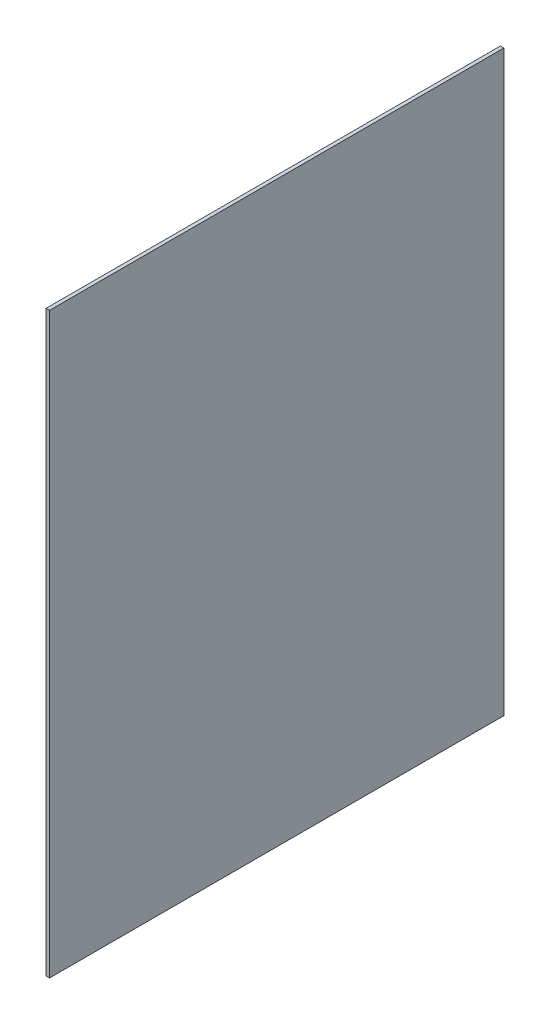
ISO-10303-21;
HEADER;
FILE_DESCRIPTION(('STEP AP214'),'2;1');
FILE_NAME('part.step','',(''),(''),'','','');
FILE_SCHEMA(('AUTOMOTIVE_DESIGN { 1 0 10303 214 1 1 1 1 }'));
ENDSEC;
DATA;
#1=APPLICATION_CONTEXT('core data for automotive mechanical design processes');
#2=APPLICATION_PROTOCOL_DEFINITION('international standard','automotive_design',2000,#1);
#3=PRODUCT_CONTEXT('',#1,'mechanical');
#4=PRODUCT('Part','Part','',(#3));
#5=PRODUCT_RELATED_PRODUCT_CATEGORY('part','',(#4));
#6=PRODUCT_DEFINITION_FORMATION('','',#4);
#7=PRODUCT_DEFINITION_CONTEXT('part definition',#1,'design');
#8=PRODUCT_DEFINITION('design','',#6,#7);
#9=PRODUCT_DEFINITION_SHAPE('','',#8);
#10=(LENGTH_UNIT() NAMED_UNIT(*) SI_UNIT(.MILLI.,.METRE.));
#11=(NAMED_UNIT(*) PLANE_ANGLE_UNIT() SI_UNIT($,.RADIAN.));
#12=(NAMED_UNIT(*) SI_UNIT($,.STERADIAN.) SOLID_ANGLE_UNIT());
#13=UNCERTAINTY_MEASURE_WITH_UNIT(LENGTH_MEASURE(1.E-05),#10,'distance_accuracy_value','');
#14=(GEOMETRIC_REPRESENTATION_CONTEXT(3) GLOBAL_UNCERTAINTY_ASSIGNED_CONTEXT((#13)) GLOBAL_UNIT_ASSIGNED_CONTEXT((#10,
#11,#12)) REPRESENTATION_CONTEXT('',''));
#15=CARTESIAN_POINT('',(0.,0.,0.));
#16=DIRECTION('',(0.,0.,1.));
#17=DIRECTION('',(1.,0.,0.));
#18=AXIS2_PLACEMENT_3D('',#15,#16,#17);
#19=CARTESIAN_POINT('',(12.7,0.,0.));
#20=DIRECTION('',(0.,0.,-1.));
#21=DIRECTION('',(-1.,0.,0.));
#22=AXIS2_PLACEMENT_3D('',#19,#20,#21);
#23=PLANE('',#22);
#24=DIRECTION('',(0.,-1.,0.));
#25=VECTOR('',#24,1.);
#26=CARTESIAN_POINT('',(0.,0.,0.));
#27=LINE('',#26,#25);
#28=CARTESIAN_POINT('',(0.,2133.6,0.));
#29=VERTEX_POINT('',#28);
#30=CARTESIAN_POINT('',(0.,0.,0.));
#31=VERTEX_POINT('',#30);
#32=EDGE_CURVE('E107',#29,#31,#27,.T.);
#33=ORIENTED_EDGE('',*,*,#32,.T.);
#34=DIRECTION('',(-1.,0.,0.));
#35=VECTOR('',#34,1.);
#36=CARTESIAN_POINT('',(12.7,0.,0.));
#37=LINE('',#36,#35);
#38=CARTESIAN_POINT('',(12.7,0.,0.));
#39=VERTEX_POINT('',#38);
#40=EDGE_CURVE('E11',#39,#31,#37,.T.);
#41=ORIENTED_EDGE('',*,*,#40,.F.);
#42=DIRECTION('',(0.,-1.,0.));
#43=VECTOR('',#42,1.);
#44=CARTESIAN_POINT('',(12.7,0.,0.));
#45=LINE('',#44,#43);
#46=CARTESIAN_POINT('',(12.7,2133.6,0.));
#47=VERTEX_POINT('',#46);
#48=EDGE_CURVE('E91',#47,#39,#45,.T.);
#49=ORIENTED_EDGE('',*,*,#48,.F.);
#50=DIRECTION('',(-1.,0.,0.));
#51=VECTOR('',#50,1.);
#52=CARTESIAN_POINT('',(12.7,2133.6,0.));
#53=LINE('',#52,#51);
#54=EDGE_CURVE('E103',#47,#29,#53,.T.);
#55=ORIENTED_EDGE('',*,*,#54,.T.);
#56=EDGE_LOOP('',(#33,#41,#49,#55));
#57=FACE_BOUND('',#56,.T.);
#58=ADVANCED_FACE('F39',(#57),#23,.F.);
#59=CARTESIAN_POINT('',(12.7,0.,0.));
#60=DIRECTION('',(0.,1.,0.));
#61=DIRECTION('',(0.,0.,1.));
#62=AXIS2_PLACEMENT_3D('',#59,#60,#61);
#63=PLANE('',#62);
#64=DIRECTION('',(0.,0.,-1.));
#65=VECTOR('',#64,1.);
#66=CARTESIAN_POINT('',(0.,0.,0.));
#67=LINE('',#66,#65);
#68=CARTESIAN_POINT('',(0.,0.,-1676.4));
#69=VERTEX_POINT('',#68);
#70=EDGE_CURVE('E96',#31,#69,#67,.T.);
#71=ORIENTED_EDGE('',*,*,#70,.T.);
#72=DIRECTION('',(-1.,0.,0.));
#73=VECTOR('',#72,1.);
#74=CARTESIAN_POINT('',(12.7,0.,-1676.4));
#75=LINE('',#74,#73);
#76=CARTESIAN_POINT('',(12.7,0.,-1676.4));
#77=VERTEX_POINT('',#76);
#78=EDGE_CURVE('E48',#77,#69,#75,.T.);
#79=ORIENTED_EDGE('',*,*,#78,.F.);
#80=DIRECTION('',(0.,0.,-1.));
#81=VECTOR('',#80,1.);
#82=CARTESIAN_POINT('',(12.7,0.,0.));
#83=LINE('',#82,#81);
#84=EDGE_CURVE('E86',#39,#77,#83,.T.);
#85=ORIENTED_EDGE('',*,*,#84,.F.);
#86=ORIENTED_EDGE('',*,*,#40,.T.);
#87=EDGE_LOOP('',(#71,#79,#85,#86));
#88=FACE_BOUND('',#87,.T.);
#89=ADVANCED_FACE('F95',(#88),#63,.F.);
#90=CARTESIAN_POINT('',(12.7,0.,-1676.4));
#91=DIRECTION('',(0.,0.,1.));
#92=DIRECTION('',(1.,0.,0.));
#93=AXIS2_PLACEMENT_3D('',#90,#91,#92);
#94=PLANE('',#93);
#95=DIRECTION('',(0.,1.,0.));
#96=VECTOR('',#95,1.);
#97=CARTESIAN_POINT('',(0.,0.,-1676.4));
#98=LINE('',#97,#96);
#99=CARTESIAN_POINT('',(0.,2133.6,-1676.4));
#100=VERTEX_POINT('',#99);
#101=EDGE_CURVE('E73',#69,#100,#98,.T.);
#102=ORIENTED_EDGE('',*,*,#101,.T.);
#103=DIRECTION('',(-1.,0.,0.));
#104=VECTOR('',#103,1.);
#105=CARTESIAN_POINT('',(12.7,2133.6,-1676.4));
#106=LINE('',#105,#104);
#107=CARTESIAN_POINT('',(12.7,2133.6,-1676.4));
#108=VERTEX_POINT('',#107);
#109=EDGE_CURVE('E98',#108,#100,#106,.T.);
#110=ORIENTED_EDGE('',*,*,#109,.F.);
#111=DIRECTION('',(0.,1.,0.));
#112=VECTOR('',#111,1.);
#113=CARTESIAN_POINT('',(12.7,0.,-1676.4));
#114=LINE('',#113,#112);
#115=EDGE_CURVE('E89',#77,#108,#114,.T.);
#116=ORIENTED_EDGE('',*,*,#115,.F.);
#117=ORIENTED_EDGE('',*,*,#78,.T.);
#118=EDGE_LOOP('',(#102,#110,#116,#117));
#119=FACE_BOUND('',#118,.T.);
#120=ADVANCED_FACE('F99',(#119),#94,.F.);
#121=CARTESIAN_POINT('',(12.7,2133.6,0.));
#122=DIRECTION('',(0.,-1.,0.));
#123=DIRECTION('',(0.,0.,-1.));
#124=AXIS2_PLACEMENT_3D('',#121,#122,#123);
#125=PLANE('',#124);
#126=DIRECTION('',(0.,0.,1.));
#127=VECTOR('',#126,1.);
#128=CARTESIAN_POINT('',(0.,2133.6,0.));
#129=LINE('',#128,#127);
#130=EDGE_CURVE('E79',#100,#29,#129,.T.);
#131=ORIENTED_EDGE('',*,*,#130,.T.);
#132=ORIENTED_EDGE('',*,*,#54,.F.);
#133=DIRECTION('',(0.,0.,1.));
#134=VECTOR('',#133,1.);
#135=CARTESIAN_POINT('',(12.7,2133.6,0.));
#136=LINE('',#135,#134);
#137=EDGE_CURVE('E56',#108,#47,#136,.T.);
#138=ORIENTED_EDGE('',*,*,#137,.F.);
#139=ORIENTED_EDGE('',*,*,#109,.T.);
#140=EDGE_LOOP('',(#131,#132,#138,#139));
#141=FACE_BOUND('',#140,.T.);
#142=ADVANCED_FACE('F120',(#141),#125,.F.);
#143=CARTESIAN_POINT('',(12.7,0.,0.));
#144=DIRECTION('',(-1.,0.,0.));
#145=DIRECTION('',(0.,0.,1.));
#146=AXIS2_PLACEMENT_3D('',#143,#144,#145);
#147=PLANE('',#146);
#148=ORIENTED_EDGE('',*,*,#48,.T.);
#149=ORIENTED_EDGE('',*,*,#84,.T.);
#150=ORIENTED_EDGE('',*,*,#115,.T.);
#151=ORIENTED_EDGE('',*,*,#137,.T.);
#152=EDGE_LOOP('',(#148,#149,#150,#151));
#153=FACE_BOUND('',#152,.T.);
#154=ADVANCED_FACE('F87',(#153),#147,.F.);
#155=CARTESIAN_POINT('',(0.,0.,0.));
#156=DIRECTION('',(-1.,0.,0.));
#157=DIRECTION('',(0.,0.,1.));
#158=AXIS2_PLACEMENT_3D('',#155,#156,#157);
#159=PLANE('',#158);
#160=ORIENTED_EDGE('',*,*,#32,.F.);
#161=ORIENTED_EDGE('',*,*,#130,.F.);
#162=ORIENTED_EDGE('',*,*,#101,.F.);
#163=ORIENTED_EDGE('',*,*,#70,.F.);
#164=EDGE_LOOP('',(#160,#161,#162,#163));
#165=FACE_BOUND('',#164,.T.);
#166=ADVANCED_FACE('F123',(#165),#159,.T.);
#167=CLOSED_SHELL('',(#58,#89,#120,#142,#154,#166));
#168=MANIFOLD_SOLID_BREP('B2',#167);
#169=ADVANCED_BREP_SHAPE_REPRESENTATION('',(#18,#168),#14);
#170=SHAPE_DEFINITION_REPRESENTATION(#9,#169);
ENDSEC;
END-ISO-10303-21;
